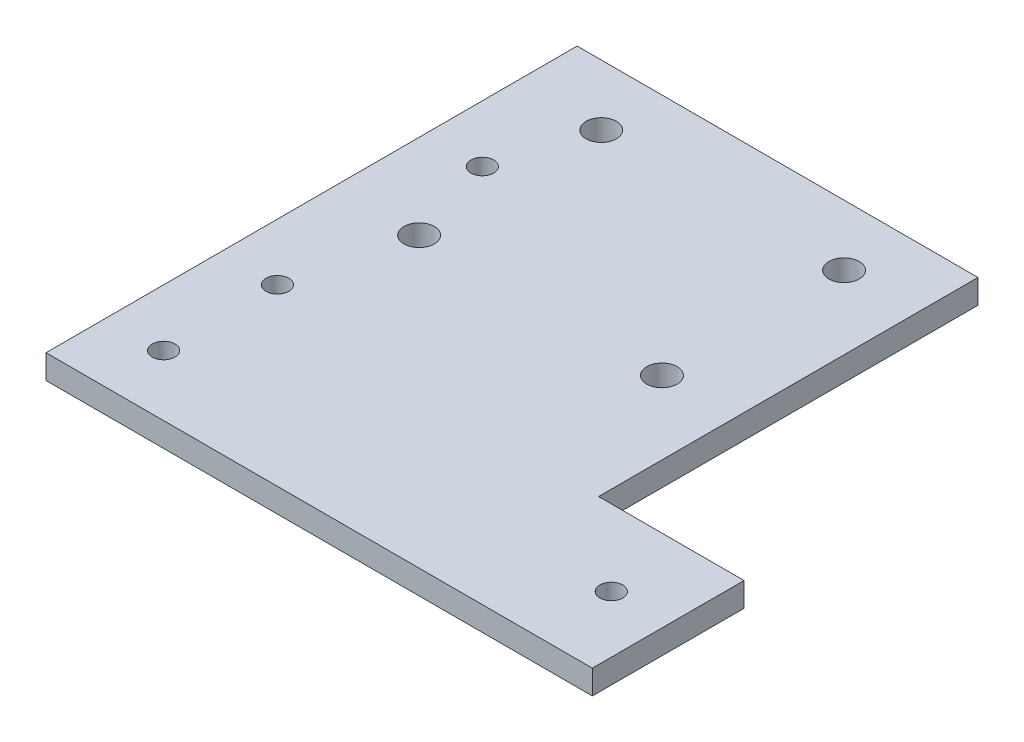
ISO-10303-21;
HEADER;
FILE_DESCRIPTION(('STEP AP214'),'2;1');
FILE_NAME('part.step','',(''),(''),'','','');
FILE_SCHEMA(('AUTOMOTIVE_DESIGN { 1 0 10303 214 1 1 1 1 }'));
ENDSEC;
DATA;
#1=APPLICATION_CONTEXT('core data for automotive mechanical design processes');
#2=APPLICATION_PROTOCOL_DEFINITION('international standard','automotive_design',2000,#1);
#3=PRODUCT_CONTEXT('',#1,'mechanical');
#4=PRODUCT('Part','Part','',(#3));
#5=PRODUCT_RELATED_PRODUCT_CATEGORY('part','',(#4));
#6=PRODUCT_DEFINITION_FORMATION('','',#4);
#7=PRODUCT_DEFINITION_CONTEXT('part definition',#1,'design');
#8=PRODUCT_DEFINITION('design','',#6,#7);
#9=PRODUCT_DEFINITION_SHAPE('','',#8);
#10=(LENGTH_UNIT() NAMED_UNIT(*) SI_UNIT(.MILLI.,.METRE.));
#11=(NAMED_UNIT(*) PLANE_ANGLE_UNIT() SI_UNIT($,.RADIAN.));
#12=(NAMED_UNIT(*) SI_UNIT($,.STERADIAN.) SOLID_ANGLE_UNIT());
#13=UNCERTAINTY_MEASURE_WITH_UNIT(LENGTH_MEASURE(1.E-05),#10,'distance_accuracy_value','');
#14=(GEOMETRIC_REPRESENTATION_CONTEXT(3) GLOBAL_UNCERTAINTY_ASSIGNED_CONTEXT((#13)) GLOBAL_UNIT_ASSIGNED_CONTEXT((#10,
#11,#12)) REPRESENTATION_CONTEXT('',''));
#15=CARTESIAN_POINT('',(0.,0.,0.));
#16=DIRECTION('',(0.,0.,1.));
#17=DIRECTION('',(1.,0.,0.));
#18=AXIS2_PLACEMENT_3D('',#15,#16,#17);
#19=CARTESIAN_POINT('',(7.5,3.175,-20.));
#20=DIRECTION('',(0.,-1.,0.));
#21=DIRECTION('',(0.,0.,-1.));
#22=AXIS2_PLACEMENT_3D('',#19,#20,#21);
#23=CYLINDRICAL_SURFACE('',#22,1.5);
#24=CARTESIAN_POINT('',(7.5,3.175,-20.));
#25=DIRECTION('',(0.,1.,0.));
#26=DIRECTION('',(0.,0.,1.));
#27=AXIS2_PLACEMENT_3D('',#24,#25,#26);
#28=CIRCLE('',#27,1.5);
#29=CARTESIAN_POINT('',(7.5,3.175,-18.5));
#30=VERTEX_POINT('',#29);
#31=EDGE_CURVE('E74',#30,#30,#28,.T.);
#32=ORIENTED_EDGE('',*,*,#31,.T.);
#33=EDGE_LOOP('',(#32));
#34=FACE_BOUND('',#33,.T.);
#35=CARTESIAN_POINT('',(7.5,0.,-20.));
#36=DIRECTION('',(0.,1.,0.));
#37=DIRECTION('',(0.,0.,1.));
#38=AXIS2_PLACEMENT_3D('',#35,#36,#37);
#39=CIRCLE('',#38,1.5);
#40=CARTESIAN_POINT('',(7.5,0.,-18.5));
#41=VERTEX_POINT('',#40);
#42=EDGE_CURVE('E146',#41,#41,#39,.T.);
#43=ORIENTED_EDGE('',*,*,#42,.F.);
#44=EDGE_LOOP('',(#43));
#45=FACE_BOUND('',#44,.T.);
#46=ADVANCED_FACE('F65',(#34,#45),#23,.F.);
#47=CARTESIAN_POINT('',(11.175,3.175,-32.));
#48=DIRECTION('',(0.,-1.,0.));
#49=DIRECTION('',(0.,0.,-1.));
#50=AXIS2_PLACEMENT_3D('',#47,#48,#49);
#51=CYLINDRICAL_SURFACE('',#50,2.);
#52=CARTESIAN_POINT('',(11.175,3.175,-32.));
#53=DIRECTION('',(0.,1.,0.));
#54=DIRECTION('',(0.,0.,1.));
#55=AXIS2_PLACEMENT_3D('',#52,#53,#54);
#56=CIRCLE('',#55,2.);
#57=CARTESIAN_POINT('',(11.175,3.175,-30.));
#58=VERTEX_POINT('',#57);
#59=EDGE_CURVE('E167',#58,#58,#56,.T.);
#60=ORIENTED_EDGE('',*,*,#59,.T.);
#61=EDGE_LOOP('',(#60));
#62=FACE_BOUND('',#61,.T.);
#63=CARTESIAN_POINT('',(11.175,0.,-32.));
#64=DIRECTION('',(0.,1.,0.));
#65=DIRECTION('',(0.,0.,1.));
#66=AXIS2_PLACEMENT_3D('',#63,#64,#65);
#67=CIRCLE('',#66,2.);
#68=CARTESIAN_POINT('',(11.175,0.,-30.));
#69=VERTEX_POINT('',#68);
#70=EDGE_CURVE('E139',#69,#69,#67,.T.);
#71=ORIENTED_EDGE('',*,*,#70,.F.);
#72=EDGE_LOOP('',(#71));
#73=FACE_BOUND('',#72,.T.);
#74=ADVANCED_FACE('F190',(#62,#73),#51,.F.);
#75=CARTESIAN_POINT('',(11.175,3.175,-7.99999999999999));
#76=DIRECTION('',(0.,-1.,0.));
#77=DIRECTION('',(0.,0.,-1.));
#78=AXIS2_PLACEMENT_3D('',#75,#76,#77);
#79=CYLINDRICAL_SURFACE('',#78,2.);
#80=CARTESIAN_POINT('',(11.175,3.175,-7.99999999999999));
#81=DIRECTION('',(0.,1.,0.));
#82=DIRECTION('',(0.,0.,1.));
#83=AXIS2_PLACEMENT_3D('',#80,#81,#82);
#84=CIRCLE('',#83,2.);
#85=CARTESIAN_POINT('',(11.175,3.175,-6.));
#86=VERTEX_POINT('',#85);
#87=EDGE_CURVE('E164',#86,#86,#84,.T.);
#88=ORIENTED_EDGE('',*,*,#87,.T.);
#89=EDGE_LOOP('',(#88));
#90=FACE_BOUND('',#89,.T.);
#91=CARTESIAN_POINT('',(11.175,0.,-7.99999999999999));
#92=DIRECTION('',(0.,1.,0.));
#93=DIRECTION('',(0.,0.,1.));
#94=AXIS2_PLACEMENT_3D('',#91,#92,#93);
#95=CIRCLE('',#94,2.);
#96=CARTESIAN_POINT('',(11.175,0.,-6.));
#97=VERTEX_POINT('',#96);
#98=EDGE_CURVE('E136',#97,#97,#95,.T.);
#99=ORIENTED_EDGE('',*,*,#98,.F.);
#100=EDGE_LOOP('',(#99));
#101=FACE_BOUND('',#100,.T.);
#102=ADVANCED_FACE('F196',(#90,#101),#79,.F.);
#103=CARTESIAN_POINT('',(0.,3.175,-40.));
#104=DIRECTION('',(0.,0.,-1.));
#105=DIRECTION('',(-1.,0.,0.));
#106=AXIS2_PLACEMENT_3D('',#103,#104,#105);
#107=PLANE('',#106);
#108=DIRECTION('',(0.,1.,0.));
#109=VECTOR('',#108,1.);
#110=CARTESIAN_POINT('',(52.825,0.,-40.));
#111=LINE('',#110,#109);
#112=CARTESIAN_POINT('',(52.825,0.,-40.));
#113=VERTEX_POINT('',#112);
#114=CARTESIAN_POINT('',(52.825,3.175,-40.));
#115=VERTEX_POINT('',#114);
#116=EDGE_CURVE('E116',#113,#115,#111,.T.);
#117=ORIENTED_EDGE('',*,*,#116,.F.);
#118=DIRECTION('',(1.,0.,0.));
#119=VECTOR('',#118,1.);
#120=CARTESIAN_POINT('',(0.,0.,-40.));
#121=LINE('',#120,#119);
#122=CARTESIAN_POINT('',(0.,0.,-40.));
#123=VERTEX_POINT('',#122);
#124=EDGE_CURVE('E126',#123,#113,#121,.T.);
#125=ORIENTED_EDGE('',*,*,#124,.F.);
#126=DIRECTION('',(0.,-1.,0.));
#127=VECTOR('',#126,1.);
#128=CARTESIAN_POINT('',(0.,3.175,-40.));
#129=LINE('',#128,#127);
#130=CARTESIAN_POINT('',(0.,3.175,-40.));
#131=VERTEX_POINT('',#130);
#132=EDGE_CURVE('E12',#131,#123,#129,.T.);
#133=ORIENTED_EDGE('',*,*,#132,.F.);
#134=DIRECTION('',(1.,0.,0.));
#135=VECTOR('',#134,1.);
#136=CARTESIAN_POINT('',(0.,3.175,-40.));
#137=LINE('',#136,#135);
#138=EDGE_CURVE('E128',#131,#115,#137,.T.);
#139=ORIENTED_EDGE('',*,*,#138,.T.);
#140=EDGE_LOOP('',(#117,#125,#133,#139));
#141=FACE_BOUND('',#140,.T.);
#142=ADVANCED_FACE('F125',(#141),#107,.T.);
#143=CARTESIAN_POINT('',(0.,3.175,0.));
#144=DIRECTION('',(-1.,0.,0.));
#145=DIRECTION('',(0.,0.,1.));
#146=AXIS2_PLACEMENT_3D('',#143,#144,#145);
#147=PLANE('',#146);
#148=DIRECTION('',(0.,0.,-1.));
#149=VECTOR('',#148,1.);
#150=CARTESIAN_POINT('',(0.,0.,0.));
#151=LINE('',#150,#149);
#152=CARTESIAN_POINT('',(0.,0.,30.));
#153=VERTEX_POINT('',#152);
#154=EDGE_CURVE('E135',#153,#123,#151,.T.);
#155=ORIENTED_EDGE('',*,*,#154,.F.);
#156=DIRECTION('',(0.,1.,0.));
#157=VECTOR('',#156,1.);
#158=CARTESIAN_POINT('',(0.,0.,30.));
#159=LINE('',#158,#157);
#160=CARTESIAN_POINT('',(0.,3.175,30.));
#161=VERTEX_POINT('',#160);
#162=EDGE_CURVE('E174',#153,#161,#159,.T.);
#163=ORIENTED_EDGE('',*,*,#162,.T.);
#164=DIRECTION('',(0.,0.,-1.));
#165=VECTOR('',#164,1.);
#166=CARTESIAN_POINT('',(0.,3.175,0.));
#167=LINE('',#166,#165);
#168=EDGE_CURVE('E157',#161,#131,#167,.T.);
#169=ORIENTED_EDGE('',*,*,#168,.T.);
#170=ORIENTED_EDGE('',*,*,#132,.T.);
#171=EDGE_LOOP('',(#155,#163,#169,#170));
#172=FACE_BOUND('',#171,.T.);
#173=ADVANCED_FACE('F181',(#172),#147,.T.);
#174=CARTESIAN_POINT('',(43.175,3.175,-32.));
#175=DIRECTION('',(0.,-1.,0.));
#176=DIRECTION('',(0.,0.,-1.));
#177=AXIS2_PLACEMENT_3D('',#174,#175,#176);
#178=CYLINDRICAL_SURFACE('',#177,2.);
#179=CARTESIAN_POINT('',(43.175,3.175,-32.));
#180=DIRECTION('',(0.,1.,0.));
#181=DIRECTION('',(0.,0.,1.));
#182=AXIS2_PLACEMENT_3D('',#179,#180,#181);
#183=CIRCLE('',#182,2.);
#184=CARTESIAN_POINT('',(43.175,3.175,-30.));
#185=VERTEX_POINT('',#184);
#186=EDGE_CURVE('E152',#185,#185,#183,.T.);
#187=ORIENTED_EDGE('',*,*,#186,.T.);
#188=EDGE_LOOP('',(#187));
#189=FACE_BOUND('',#188,.T.);
#190=CARTESIAN_POINT('',(43.175,0.,-32.));
#191=DIRECTION('',(0.,1.,0.));
#192=DIRECTION('',(0.,0.,1.));
#193=AXIS2_PLACEMENT_3D('',#190,#191,#192);
#194=CIRCLE('',#193,2.);
#195=CARTESIAN_POINT('',(43.175,0.,-30.));
#196=VERTEX_POINT('',#195);
#197=EDGE_CURVE('E141',#196,#196,#194,.T.);
#198=ORIENTED_EDGE('',*,*,#197,.F.);
#199=EDGE_LOOP('',(#198));
#200=FACE_BOUND('',#199,.T.);
#201=ADVANCED_FACE('F179',(#189,#200),#178,.F.);
#202=CARTESIAN_POINT('',(43.175,3.175,-8.));
#203=DIRECTION('',(0.,-1.,0.));
#204=DIRECTION('',(0.,0.,-1.));
#205=AXIS2_PLACEMENT_3D('',#202,#203,#204);
#206=CYLINDRICAL_SURFACE('',#205,2.);
#207=CARTESIAN_POINT('',(43.175,3.175,-8.));
#208=DIRECTION('',(0.,1.,0.));
#209=DIRECTION('',(0.,0.,1.));
#210=AXIS2_PLACEMENT_3D('',#207,#208,#209);
#211=CIRCLE('',#210,2.);
#212=CARTESIAN_POINT('',(43.175,3.175,-6.));
#213=VERTEX_POINT('',#212);
#214=EDGE_CURVE('E148',#213,#213,#211,.T.);
#215=ORIENTED_EDGE('',*,*,#214,.T.);
#216=EDGE_LOOP('',(#215));
#217=FACE_BOUND('',#216,.T.);
#218=CARTESIAN_POINT('',(43.175,0.,-8.));
#219=DIRECTION('',(0.,1.,0.));
#220=DIRECTION('',(0.,0.,1.));
#221=AXIS2_PLACEMENT_3D('',#218,#219,#220);
#222=CIRCLE('',#221,2.);
#223=CARTESIAN_POINT('',(43.175,0.,-6.));
#224=VERTEX_POINT('',#223);
#225=EDGE_CURVE('E172',#224,#224,#222,.T.);
#226=ORIENTED_EDGE('',*,*,#225,.F.);
#227=EDGE_LOOP('',(#226));
#228=FACE_BOUND('',#227,.T.);
#229=ADVANCED_FACE('F67',(#217,#228),#206,.F.);
#230=CARTESIAN_POINT('',(0.,0.,0.));
#231=DIRECTION('',(0.,1.,0.));
#232=DIRECTION('',(0.,0.,1.));
#233=AXIS2_PLACEMENT_3D('',#230,#231,#232);
#234=PLANE('',#233);
#235=ORIENTED_EDGE('',*,*,#225,.T.);
#236=EDGE_LOOP('',(#235));
#237=FACE_BOUND('',#236,.T.);
#238=ORIENTED_EDGE('',*,*,#197,.T.);
#239=EDGE_LOOP('',(#238));
#240=FACE_BOUND('',#239,.T.);
#241=ORIENTED_EDGE('',*,*,#124,.T.);
#242=DIRECTION('',(0.,0.,1.));
#243=VECTOR('',#242,1.);
#244=CARTESIAN_POINT('',(52.825,0.,0.));
#245=LINE('',#244,#243);
#246=CARTESIAN_POINT('',(52.825,0.,10.));
#247=VERTEX_POINT('',#246);
#248=EDGE_CURVE('E113',#113,#247,#245,.T.);
#249=ORIENTED_EDGE('',*,*,#248,.T.);
#250=DIRECTION('',(1.,0.,0.));
#251=VECTOR('',#250,1.);
#252=CARTESIAN_POINT('',(0.,0.,10.));
#253=LINE('',#252,#251);
#254=CARTESIAN_POINT('',(72.,0.,10.));
#255=VERTEX_POINT('',#254);
#256=EDGE_CURVE('E123',#247,#255,#253,.T.);
#257=ORIENTED_EDGE('',*,*,#256,.T.);
#258=DIRECTION('',(0.,0.,1.));
#259=VECTOR('',#258,1.);
#260=CARTESIAN_POINT('',(72.,0.,0.));
#261=LINE('',#260,#259);
#262=CARTESIAN_POINT('',(72.,0.,30.));
#263=VERTEX_POINT('',#262);
#264=EDGE_CURVE('E423',#255,#263,#261,.T.);
#265=ORIENTED_EDGE('',*,*,#264,.T.);
#266=DIRECTION('',(-1.,0.,0.));
#267=VECTOR('',#266,1.);
#268=CARTESIAN_POINT('',(0.,0.,30.));
#269=LINE('',#268,#267);
#270=EDGE_CURVE('E422',#263,#153,#269,.T.);
#271=ORIENTED_EDGE('',*,*,#270,.T.);
#272=ORIENTED_EDGE('',*,*,#154,.T.);
#273=EDGE_LOOP('',(#241,#249,#257,#265,#271,#272));
#274=FACE_BOUND('',#273,.T.);
#275=ORIENTED_EDGE('',*,*,#98,.T.);
#276=EDGE_LOOP('',(#275));
#277=FACE_BOUND('',#276,.T.);
#278=ORIENTED_EDGE('',*,*,#70,.T.);
#279=EDGE_LOOP('',(#278));
#280=FACE_BOUND('',#279,.T.);
#281=ORIENTED_EDGE('',*,*,#42,.T.);
#282=EDGE_LOOP('',(#281));
#283=FACE_BOUND('',#282,.T.);
#284=CARTESIAN_POINT('',(64.5,0.,20.));
#285=DIRECTION('',(0.,1.,0.));
#286=DIRECTION('',(0.,0.,1.));
#287=AXIS2_PLACEMENT_3D('',#284,#285,#286);
#288=CIRCLE('',#287,1.5);
#289=CARTESIAN_POINT('',(64.5,0.,21.5));
#290=VERTEX_POINT('',#289);
#291=EDGE_CURVE('E409',#290,#290,#288,.T.);
#292=ORIENTED_EDGE('',*,*,#291,.T.);
#293=EDGE_LOOP('',(#292));
#294=FACE_BOUND('',#293,.T.);
#295=CARTESIAN_POINT('',(7.50000000000001,0.,7.));
#296=DIRECTION('',(0.,1.,0.));
#297=DIRECTION('',(0.,0.,1.));
#298=AXIS2_PLACEMENT_3D('',#295,#296,#297);
#299=CIRCLE('',#298,1.5);
#300=CARTESIAN_POINT('',(7.50000000000001,0.,8.5));
#301=VERTEX_POINT('',#300);
#302=EDGE_CURVE('E428',#301,#301,#299,.T.);
#303=ORIENTED_EDGE('',*,*,#302,.T.);
#304=EDGE_LOOP('',(#303));
#305=FACE_BOUND('',#304,.T.);
#306=CARTESIAN_POINT('',(7.50000000000001,0.,22.));
#307=DIRECTION('',(0.,1.,0.));
#308=DIRECTION('',(0.,0.,1.));
#309=AXIS2_PLACEMENT_3D('',#306,#307,#308);
#310=CIRCLE('',#309,1.5);
#311=CARTESIAN_POINT('',(7.50000000000001,0.,23.5));
#312=VERTEX_POINT('',#311);
#313=EDGE_CURVE('E424',#312,#312,#310,.T.);
#314=ORIENTED_EDGE('',*,*,#313,.T.);
#315=EDGE_LOOP('',(#314));
#316=FACE_BOUND('',#315,.T.);
#317=ADVANCED_FACE('F132',(#237,#240,#274,#277,#280,#283,#294,#305,#316),#234,.F.);
#318=CARTESIAN_POINT('',(0.,3.175,0.));
#319=DIRECTION('',(0.,1.,0.));
#320=DIRECTION('',(0.,0.,1.));
#321=AXIS2_PLACEMENT_3D('',#318,#319,#320);
#322=PLANE('',#321);
#323=DIRECTION('',(0.,0.,1.));
#324=VECTOR('',#323,1.);
#325=CARTESIAN_POINT('',(52.825,3.175,0.));
#326=LINE('',#325,#324);
#327=CARTESIAN_POINT('',(52.825,3.175,10.));
#328=VERTEX_POINT('',#327);
#329=EDGE_CURVE('E376',#115,#328,#326,.T.);
#330=ORIENTED_EDGE('',*,*,#329,.F.);
#331=ORIENTED_EDGE('',*,*,#138,.F.);
#332=ORIENTED_EDGE('',*,*,#168,.F.);
#333=DIRECTION('',(-1.,0.,0.));
#334=VECTOR('',#333,1.);
#335=CARTESIAN_POINT('',(0.,3.175,30.));
#336=LINE('',#335,#334);
#337=CARTESIAN_POINT('',(72.,3.175,30.));
#338=VERTEX_POINT('',#337);
#339=EDGE_CURVE('E397',#338,#161,#336,.T.);
#340=ORIENTED_EDGE('',*,*,#339,.F.);
#341=DIRECTION('',(0.,0.,1.));
#342=VECTOR('',#341,1.);
#343=CARTESIAN_POINT('',(72.,3.175,0.));
#344=LINE('',#343,#342);
#345=CARTESIAN_POINT('',(72.,3.175,10.));
#346=VERTEX_POINT('',#345);
#347=EDGE_CURVE('E400',#346,#338,#344,.T.);
#348=ORIENTED_EDGE('',*,*,#347,.F.);
#349=DIRECTION('',(1.,0.,0.));
#350=VECTOR('',#349,1.);
#351=CARTESIAN_POINT('',(0.,3.175,10.));
#352=LINE('',#351,#350);
#353=EDGE_CURVE('E406',#328,#346,#352,.T.);
#354=ORIENTED_EDGE('',*,*,#353,.F.);
#355=EDGE_LOOP('',(#330,#331,#332,#340,#348,#354));
#356=FACE_BOUND('',#355,.T.);
#357=ORIENTED_EDGE('',*,*,#214,.F.);
#358=EDGE_LOOP('',(#357));
#359=FACE_BOUND('',#358,.T.);
#360=ORIENTED_EDGE('',*,*,#186,.F.);
#361=EDGE_LOOP('',(#360));
#362=FACE_BOUND('',#361,.T.);
#363=ORIENTED_EDGE('',*,*,#87,.F.);
#364=EDGE_LOOP('',(#363));
#365=FACE_BOUND('',#364,.T.);
#366=ORIENTED_EDGE('',*,*,#59,.F.);
#367=EDGE_LOOP('',(#366));
#368=FACE_BOUND('',#367,.T.);
#369=ORIENTED_EDGE('',*,*,#31,.F.);
#370=EDGE_LOOP('',(#369));
#371=FACE_BOUND('',#370,.T.);
#372=CARTESIAN_POINT('',(64.5,3.175,20.));
#373=DIRECTION('',(0.,1.,0.));
#374=DIRECTION('',(0.,0.,1.));
#375=AXIS2_PLACEMENT_3D('',#372,#373,#374);
#376=CIRCLE('',#375,1.5);
#377=CARTESIAN_POINT('',(64.5,3.175,21.5));
#378=VERTEX_POINT('',#377);
#379=EDGE_CURVE('E129',#378,#378,#376,.T.);
#380=ORIENTED_EDGE('',*,*,#379,.F.);
#381=EDGE_LOOP('',(#380));
#382=FACE_BOUND('',#381,.T.);
#383=CARTESIAN_POINT('',(7.50000000000001,3.175,7.));
#384=DIRECTION('',(0.,1.,0.));
#385=DIRECTION('',(0.,0.,1.));
#386=AXIS2_PLACEMENT_3D('',#383,#384,#385);
#387=CIRCLE('',#386,1.5);
#388=CARTESIAN_POINT('',(7.50000000000001,3.175,8.5));
#389=VERTEX_POINT('',#388);
#390=EDGE_CURVE('E392',#389,#389,#387,.T.);
#391=ORIENTED_EDGE('',*,*,#390,.F.);
#392=EDGE_LOOP('',(#391));
#393=FACE_BOUND('',#392,.T.);
#394=CARTESIAN_POINT('',(7.50000000000001,3.175,22.));
#395=DIRECTION('',(0.,1.,0.));
#396=DIRECTION('',(0.,0.,1.));
#397=AXIS2_PLACEMENT_3D('',#394,#395,#396);
#398=CIRCLE('',#397,1.5);
#399=CARTESIAN_POINT('',(7.50000000000001,3.175,23.5));
#400=VERTEX_POINT('',#399);
#401=EDGE_CURVE('E395',#400,#400,#398,.T.);
#402=ORIENTED_EDGE('',*,*,#401,.F.);
#403=EDGE_LOOP('',(#402));
#404=FACE_BOUND('',#403,.T.);
#405=ADVANCED_FACE('F233',(#356,#359,#362,#365,#368,#371,#382,#393,#404),#322,.T.);
#406=CARTESIAN_POINT('',(0.,0.,30.));
#407=DIRECTION('',(0.,0.,-1.));
#408=DIRECTION('',(-1.,0.,0.));
#409=AXIS2_PLACEMENT_3D('',#406,#407,#408);
#410=PLANE('',#409);
#411=ORIENTED_EDGE('',*,*,#339,.T.);
#412=ORIENTED_EDGE('',*,*,#162,.F.);
#413=ORIENTED_EDGE('',*,*,#270,.F.);
#414=DIRECTION('',(0.,1.,0.));
#415=VECTOR('',#414,1.);
#416=CARTESIAN_POINT('',(72.,0.,30.));
#417=LINE('',#416,#415);
#418=EDGE_CURVE('E122',#263,#338,#417,.T.);
#419=ORIENTED_EDGE('',*,*,#418,.T.);
#420=EDGE_LOOP('',(#411,#412,#413,#419));
#421=FACE_BOUND('',#420,.T.);
#422=ADVANCED_FACE('F228',(#421),#410,.F.);
#423=CARTESIAN_POINT('',(52.825,0.,0.));
#424=DIRECTION('',(-1.,0.,0.));
#425=DIRECTION('',(0.,0.,1.));
#426=AXIS2_PLACEMENT_3D('',#423,#424,#425);
#427=PLANE('',#426);
#428=ORIENTED_EDGE('',*,*,#329,.T.);
#429=DIRECTION('',(0.,1.,0.));
#430=VECTOR('',#429,1.);
#431=CARTESIAN_POINT('',(52.825,0.,10.));
#432=LINE('',#431,#430);
#433=EDGE_CURVE('E118',#247,#328,#432,.T.);
#434=ORIENTED_EDGE('',*,*,#433,.F.);
#435=ORIENTED_EDGE('',*,*,#248,.F.);
#436=ORIENTED_EDGE('',*,*,#116,.T.);
#437=EDGE_LOOP('',(#428,#434,#435,#436));
#438=FACE_BOUND('',#437,.T.);
#439=ADVANCED_FACE('F115',(#438),#427,.F.);
#440=CARTESIAN_POINT('',(0.,0.,10.));
#441=DIRECTION('',(0.,0.,1.));
#442=DIRECTION('',(1.,0.,0.));
#443=AXIS2_PLACEMENT_3D('',#440,#441,#442);
#444=PLANE('',#443);
#445=ORIENTED_EDGE('',*,*,#353,.T.);
#446=DIRECTION('',(0.,1.,0.));
#447=VECTOR('',#446,1.);
#448=CARTESIAN_POINT('',(72.,0.,10.));
#449=LINE('',#448,#447);
#450=EDGE_CURVE('E412',#255,#346,#449,.T.);
#451=ORIENTED_EDGE('',*,*,#450,.F.);
#452=ORIENTED_EDGE('',*,*,#256,.F.);
#453=ORIENTED_EDGE('',*,*,#433,.T.);
#454=EDGE_LOOP('',(#445,#451,#452,#453));
#455=FACE_BOUND('',#454,.T.);
#456=ADVANCED_FACE('F243',(#455),#444,.F.);
#457=CARTESIAN_POINT('',(7.50000000000001,0.,22.));
#458=DIRECTION('',(0.,1.,0.));
#459=DIRECTION('',(0.,0.,1.));
#460=AXIS2_PLACEMENT_3D('',#457,#458,#459);
#461=CYLINDRICAL_SURFACE('',#460,1.5);
#462=ORIENTED_EDGE('',*,*,#313,.F.);
#463=EDGE_LOOP('',(#462));
#464=FACE_BOUND('',#463,.T.);
#465=ORIENTED_EDGE('',*,*,#401,.T.);
#466=EDGE_LOOP('',(#465));
#467=FACE_BOUND('',#466,.T.);
#468=ADVANCED_FACE('F248',(#464,#467),#461,.F.);
#469=CARTESIAN_POINT('',(7.50000000000001,0.,7.));
#470=DIRECTION('',(0.,1.,0.));
#471=DIRECTION('',(0.,0.,1.));
#472=AXIS2_PLACEMENT_3D('',#469,#470,#471);
#473=CYLINDRICAL_SURFACE('',#472,1.5);
#474=ORIENTED_EDGE('',*,*,#302,.F.);
#475=EDGE_LOOP('',(#474));
#476=FACE_BOUND('',#475,.T.);
#477=ORIENTED_EDGE('',*,*,#390,.T.);
#478=EDGE_LOOP('',(#477));
#479=FACE_BOUND('',#478,.T.);
#480=ADVANCED_FACE('F258',(#476,#479),#473,.F.);
#481=CARTESIAN_POINT('',(64.5,0.,20.));
#482=DIRECTION('',(0.,1.,0.));
#483=DIRECTION('',(0.,0.,1.));
#484=AXIS2_PLACEMENT_3D('',#481,#482,#483);
#485=CYLINDRICAL_SURFACE('',#484,1.5);
#486=ORIENTED_EDGE('',*,*,#291,.F.);
#487=EDGE_LOOP('',(#486));
#488=FACE_BOUND('',#487,.T.);
#489=ORIENTED_EDGE('',*,*,#379,.T.);
#490=EDGE_LOOP('',(#489));
#491=FACE_BOUND('',#490,.T.);
#492=ADVANCED_FACE('F268',(#488,#491),#485,.F.);
#493=CARTESIAN_POINT('',(72.,0.,0.));
#494=DIRECTION('',(-1.,0.,0.));
#495=DIRECTION('',(0.,0.,1.));
#496=AXIS2_PLACEMENT_3D('',#493,#494,#495);
#497=PLANE('',#496);
#498=ORIENTED_EDGE('',*,*,#347,.T.);
#499=ORIENTED_EDGE('',*,*,#418,.F.);
#500=ORIENTED_EDGE('',*,*,#264,.F.);
#501=ORIENTED_EDGE('',*,*,#450,.T.);
#502=EDGE_LOOP('',(#498,#499,#500,#501));
#503=FACE_BOUND('',#502,.T.);
#504=ADVANCED_FACE('F277',(#503),#497,.F.);
#505=CLOSED_SHELL('',(#46,#74,#102,#142,#173,#201,#229,#317,#405,#422,#439,#456,#468,#480,#492,#504));
#506=MANIFOLD_SOLID_BREP('B2',#505);
#507=ADVANCED_BREP_SHAPE_REPRESENTATION('',(#18,#506),#14);
#508=SHAPE_DEFINITION_REPRESENTATION(#9,#507);
ENDSEC;
END-ISO-10303-21;
